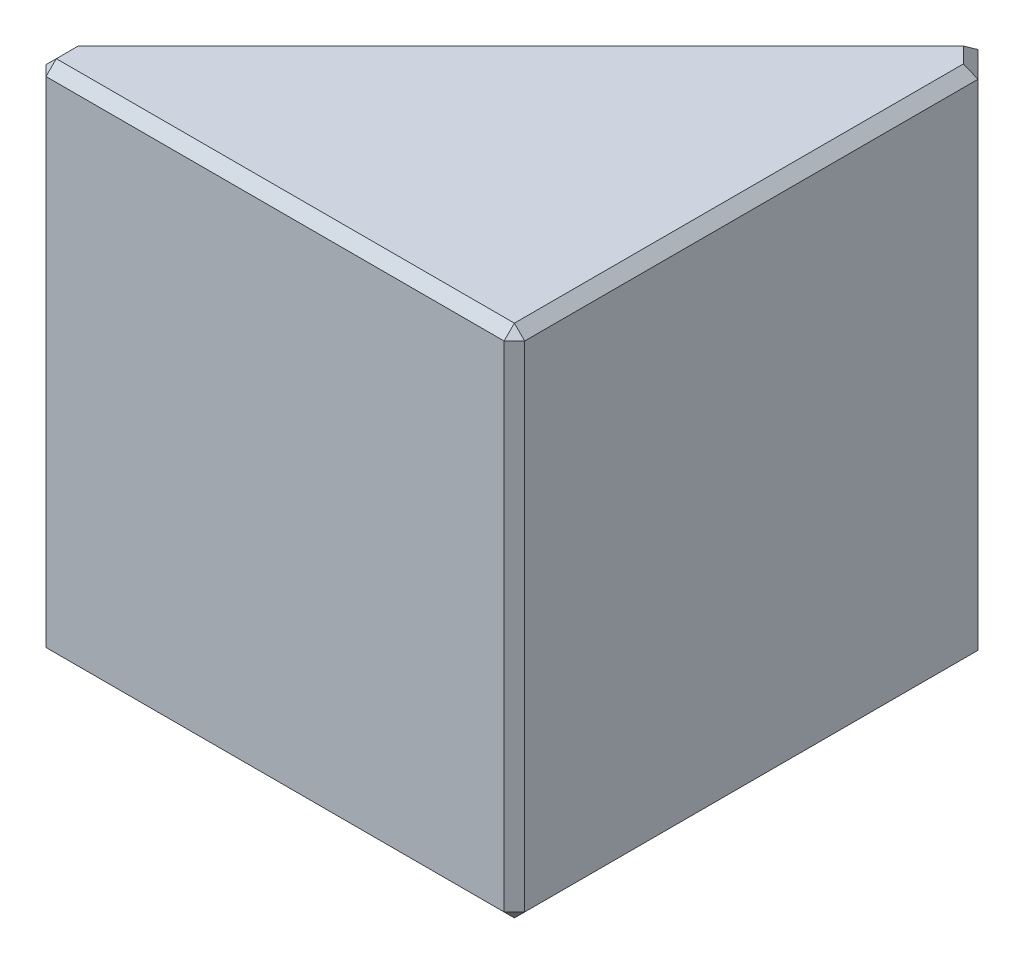
ISO-10303-21;
HEADER;
FILE_DESCRIPTION(('STEP AP214'),'2;1');
FILE_NAME('part.step','',(''),(''),'','','');
FILE_SCHEMA(('AUTOMOTIVE_DESIGN { 1 0 10303 214 1 1 1 1 }'));
ENDSEC;
DATA;
#1=APPLICATION_CONTEXT('core data for automotive mechanical design processes');
#2=APPLICATION_PROTOCOL_DEFINITION('international standard','automotive_design',2000,#1);
#3=PRODUCT_CONTEXT('',#1,'mechanical');
#4=PRODUCT('Part','Part','',(#3));
#5=PRODUCT_RELATED_PRODUCT_CATEGORY('part','',(#4));
#6=PRODUCT_DEFINITION_FORMATION('','',#4);
#7=PRODUCT_DEFINITION_CONTEXT('part definition',#1,'design');
#8=PRODUCT_DEFINITION('design','',#6,#7);
#9=PRODUCT_DEFINITION_SHAPE('','',#8);
#10=(LENGTH_UNIT() NAMED_UNIT(*) SI_UNIT(.MILLI.,.METRE.));
#11=(NAMED_UNIT(*) PLANE_ANGLE_UNIT() SI_UNIT($,.RADIAN.));
#12=(NAMED_UNIT(*) SI_UNIT($,.STERADIAN.) SOLID_ANGLE_UNIT());
#13=UNCERTAINTY_MEASURE_WITH_UNIT(LENGTH_MEASURE(1.E-05),#10,'distance_accuracy_value','');
#14=(GEOMETRIC_REPRESENTATION_CONTEXT(3) GLOBAL_UNCERTAINTY_ASSIGNED_CONTEXT((#13)) GLOBAL_UNIT_ASSIGNED_CONTEXT((#10,
#11,#12)) REPRESENTATION_CONTEXT('',''));
#15=CARTESIAN_POINT('',(0.,0.,0.));
#16=DIRECTION('',(0.,0.,1.));
#17=DIRECTION('',(1.,0.,0.));
#18=AXIS2_PLACEMENT_3D('',#15,#16,#17);
#19=CARTESIAN_POINT('',(0.,50.,0.));
#20=DIRECTION('',(0.,0.,-1.));
#21=DIRECTION('',(-1.,0.,0.));
#22=AXIS2_PLACEMENT_3D('',#19,#20,#21);
#23=PLANE('',#22);
#24=DIRECTION('',(1.,0.,0.));
#25=VECTOR('',#24,1.);
#26=CARTESIAN_POINT('',(0.,1.00000000000001,0.));
#27=LINE('',#26,#25);
#28=CARTESIAN_POINT('',(4.53553390593276,1.00000000000001,0.));
#29=VERTEX_POINT('',#28);
#30=CARTESIAN_POINT('',(49.,1.00000000000001,0.));
#31=VERTEX_POINT('',#30);
#32=EDGE_CURVE('E219',#29,#31,#27,.T.);
#33=ORIENTED_EDGE('',*,*,#32,.T.);
#34=DIRECTION('',(0.,1.,0.));
#35=VECTOR('',#34,1.);
#36=CARTESIAN_POINT('',(49.,50.,0.));
#37=LINE('',#36,#35);
#38=CARTESIAN_POINT('',(49.,49.,0.));
#39=VERTEX_POINT('',#38);
#40=EDGE_CURVE('E221',#31,#39,#37,.T.);
#41=ORIENTED_EDGE('',*,*,#40,.T.);
#42=DIRECTION('',(-1.,0.,0.));
#43=VECTOR('',#42,1.);
#44=CARTESIAN_POINT('',(3.53553390593274,49.,0.));
#45=LINE('',#44,#43);
#46=CARTESIAN_POINT('',(4.53553390593276,49.,0.));
#47=VERTEX_POINT('',#46);
#48=EDGE_CURVE('E143',#39,#47,#45,.T.);
#49=ORIENTED_EDGE('',*,*,#48,.T.);
#50=DIRECTION('',(0.,-1.,0.));
#51=VECTOR('',#50,1.);
#52=CARTESIAN_POINT('',(4.53553390593276,0.,0.));
#53=LINE('',#52,#51);
#54=EDGE_CURVE('E217',#47,#29,#53,.T.);
#55=ORIENTED_EDGE('',*,*,#54,.T.);
#56=EDGE_LOOP('',(#33,#41,#49,#55));
#57=FACE_BOUND('',#56,.T.);
#58=ADVANCED_FACE('F43',(#57),#23,.F.);
#59=CARTESIAN_POINT('',(50.,50.,0.));
#60=DIRECTION('',(-1.,0.,0.));
#61=DIRECTION('',(0.,0.,1.));
#62=AXIS2_PLACEMENT_3D('',#59,#60,#61);
#63=PLANE('',#62);
#64=DIRECTION('',(0.,-1.,0.));
#65=VECTOR('',#64,1.);
#66=CARTESIAN_POINT('',(50.,50.,-1.00000000000002));
#67=LINE('',#66,#65);
#68=CARTESIAN_POINT('',(50.,49.,-1.00000000000002));
#69=VERTEX_POINT('',#68);
#70=CARTESIAN_POINT('',(50.,1.00000000000002,-1.00000000000002));
#71=VERTEX_POINT('',#70);
#72=EDGE_CURVE('E139',#69,#71,#67,.T.);
#73=ORIENTED_EDGE('',*,*,#72,.T.);
#74=DIRECTION('',(0.,0.,-1.));
#75=VECTOR('',#74,1.);
#76=CARTESIAN_POINT('',(50.,1.00000000000002,0.));
#77=LINE('',#76,#75);
#78=CARTESIAN_POINT('',(50.,1.00000000000002,-45.));
#79=VERTEX_POINT('',#78);
#80=EDGE_CURVE('E133',#71,#79,#77,.T.);
#81=ORIENTED_EDGE('',*,*,#80,.T.);
#82=DIRECTION('',(0.,1.,0.));
#83=VECTOR('',#82,1.);
#84=CARTESIAN_POINT('',(50.,50.,-45.));
#85=LINE('',#84,#83);
#86=CARTESIAN_POINT('',(50.,49.,-45.));
#87=VERTEX_POINT('',#86);
#88=EDGE_CURVE('E136',#79,#87,#85,.T.);
#89=ORIENTED_EDGE('',*,*,#88,.T.);
#90=DIRECTION('',(0.,0.,1.));
#91=VECTOR('',#90,1.);
#92=CARTESIAN_POINT('',(50.,49.,0.));
#93=LINE('',#92,#91);
#94=EDGE_CURVE('E153',#87,#69,#93,.T.);
#95=ORIENTED_EDGE('',*,*,#94,.T.);
#96=EDGE_LOOP('',(#73,#81,#89,#95));
#97=FACE_BOUND('',#96,.T.);
#98=ADVANCED_FACE('F135',(#97),#63,.F.);
#99=CARTESIAN_POINT('',(0.,50.,0.));
#100=DIRECTION('',(0.707106781186547,0.,0.707106781186547));
#101=DIRECTION('',(0.707106781186548,0.,-0.707106781186548));
#102=AXIS2_PLACEMENT_3D('',#99,#100,#101);
#103=PLANE('',#102);
#104=DIRECTION('',(0.,-1.,0.));
#105=VECTOR('',#104,1.);
#106=CARTESIAN_POINT('',(47.5,50.,-47.5));
#107=LINE('',#106,#105);
#108=CARTESIAN_POINT('',(47.5,49.,-47.5));
#109=VERTEX_POINT('',#108);
#110=CARTESIAN_POINT('',(47.5,1.00000000000002,-47.5));
#111=VERTEX_POINT('',#110);
#112=EDGE_CURVE('E154',#109,#111,#107,.T.);
#113=ORIENTED_EDGE('',*,*,#112,.T.);
#114=DIRECTION('',(-0.707106781186548,0.,0.707106781186548));
#115=VECTOR('',#114,1.);
#116=CARTESIAN_POINT('',(0.,1.00000000000001,0.));
#117=LINE('',#116,#115);
#118=CARTESIAN_POINT('',(3.53553390593274,1.00000000000001,-3.53553390593274));
#119=VERTEX_POINT('',#118);
#120=EDGE_CURVE('E242',#111,#119,#117,.T.);
#121=ORIENTED_EDGE('',*,*,#120,.T.);
#122=DIRECTION('',(0.,1.,0.));
#123=VECTOR('',#122,1.);
#124=CARTESIAN_POINT('',(3.53553390593274,50.,-3.53553390593274));
#125=LINE('',#124,#123);
#126=CARTESIAN_POINT('',(3.53553390593274,49.,-3.53553390593274));
#127=VERTEX_POINT('',#126);
#128=EDGE_CURVE('E204',#119,#127,#125,.T.);
#129=ORIENTED_EDGE('',*,*,#128,.T.);
#130=DIRECTION('',(0.707106781186548,0.,-0.707106781186548));
#131=VECTOR('',#130,1.);
#132=CARTESIAN_POINT('',(47.5,49.,-47.5));
#133=LINE('',#132,#131);
#134=EDGE_CURVE('E240',#127,#109,#133,.T.);
#135=ORIENTED_EDGE('',*,*,#134,.T.);
#136=EDGE_LOOP('',(#113,#121,#129,#135));
#137=FACE_BOUND('',#136,.T.);
#138=ADVANCED_FACE('F304',(#137),#103,.F.);
#139=CARTESIAN_POINT('',(0.,50.,0.));
#140=DIRECTION('',(0.,1.,0.));
#141=DIRECTION('',(0.,0.,1.));
#142=AXIS2_PLACEMENT_3D('',#139,#140,#141);
#143=PLANE('',#142);
#144=DIRECTION('',(0.,0.,1.));
#145=VECTOR('',#144,1.);
#146=CARTESIAN_POINT('',(4.53553390593276,50.,0.));
#147=LINE('',#146,#145);
#148=CARTESIAN_POINT('',(4.53553390593275,50.,-3.12132034355964));
#149=VERTEX_POINT('',#148);
#150=CARTESIAN_POINT('',(4.53553390593276,50.,-1.00000000000001));
#151=VERTEX_POINT('',#150);
#152=EDGE_CURVE('E53',#149,#151,#147,.T.);
#153=ORIENTED_EDGE('',*,*,#152,.T.);
#154=DIRECTION('',(1.,0.,0.));
#155=VECTOR('',#154,1.);
#156=CARTESIAN_POINT('',(50.,50.,-1.00000000000001));
#157=LINE('',#156,#155);
#158=CARTESIAN_POINT('',(49.,50.,-1.00000000000001));
#159=VERTEX_POINT('',#158);
#160=EDGE_CURVE('E11',#151,#159,#157,.T.);
#161=ORIENTED_EDGE('',*,*,#160,.T.);
#162=DIRECTION('',(0.,0.,-1.));
#163=VECTOR('',#162,1.);
#164=CARTESIAN_POINT('',(49.,50.,-45.));
#165=LINE('',#164,#163);
#166=CARTESIAN_POINT('',(49.,50.,-44.5857864376269));
#167=VERTEX_POINT('',#166);
#168=EDGE_CURVE('E165',#159,#167,#165,.T.);
#169=ORIENTED_EDGE('',*,*,#168,.T.);
#170=DIRECTION('',(-0.707106781186551,0.,-0.707106781186544));
#171=VECTOR('',#170,1.);
#172=CARTESIAN_POINT('',(46.7928932188132,50.,-46.7928932188137));
#173=LINE('',#172,#171);
#174=CARTESIAN_POINT('',(47.5,50.,-46.0857864376269));
#175=VERTEX_POINT('',#174);
#176=EDGE_CURVE('E246',#167,#175,#173,.T.);
#177=ORIENTED_EDGE('',*,*,#176,.T.);
#178=DIRECTION('',(-0.707106781186548,0.,0.707106781186548));
#179=VECTOR('',#178,1.);
#180=CARTESIAN_POINT('',(4.2426406871193,50.,-2.82842712474618));
#181=LINE('',#180,#179);
#182=EDGE_CURVE('E64',#175,#149,#181,.T.);
#183=ORIENTED_EDGE('',*,*,#182,.T.);
#184=EDGE_LOOP('',(#153,#161,#169,#177,#183));
#185=FACE_BOUND('',#184,.T.);
#186=ADVANCED_FACE('F517',(#185),#143,.T.);
#187=CARTESIAN_POINT('',(0.,0.,0.));
#188=DIRECTION('',(0.,1.,0.));
#189=DIRECTION('',(0.,0.,1.));
#190=AXIS2_PLACEMENT_3D('',#187,#188,#189);
#191=PLANE('',#190);
#192=DIRECTION('',(-1.,0.,0.));
#193=VECTOR('',#192,1.);
#194=CARTESIAN_POINT('',(0.,0.,-1.00000000000002));
#195=LINE('',#194,#193);
#196=CARTESIAN_POINT('',(49.,0.,-1.00000000000002));
#197=VERTEX_POINT('',#196);
#198=CARTESIAN_POINT('',(4.53553390593276,0.,-1.00000000000002));
#199=VERTEX_POINT('',#198);
#200=EDGE_CURVE('E224',#197,#199,#195,.T.);
#201=ORIENTED_EDGE('',*,*,#200,.T.);
#202=DIRECTION('',(0.,0.,-1.));
#203=VECTOR('',#202,1.);
#204=CARTESIAN_POINT('',(4.53553390593275,0.,-3.53553390593274));
#205=LINE('',#204,#203);
#206=CARTESIAN_POINT('',(4.53553390593275,0.,-3.12132034355962));
#207=VERTEX_POINT('',#206);
#208=EDGE_CURVE('E231',#199,#207,#205,.T.);
#209=ORIENTED_EDGE('',*,*,#208,.T.);
#210=DIRECTION('',(0.707106781186548,0.,-0.707106781186548));
#211=VECTOR('',#210,1.);
#212=CARTESIAN_POINT('',(0.707106781186568,0.,0.707106781186568));
#213=LINE('',#212,#211);
#214=CARTESIAN_POINT('',(47.5,0.,-46.0857864376269));
#215=VERTEX_POINT('',#214);
#216=EDGE_CURVE('E229',#207,#215,#213,.T.);
#217=ORIENTED_EDGE('',*,*,#216,.T.);
#218=DIRECTION('',(0.707106781186551,0.,0.707106781186544));
#219=VECTOR('',#218,1.);
#220=CARTESIAN_POINT('',(49.2928932188134,0.,-44.2928932188134));
#221=LINE('',#220,#219);
#222=CARTESIAN_POINT('',(49.,0.,-44.5857864376269));
#223=VERTEX_POINT('',#222);
#224=EDGE_CURVE('E227',#215,#223,#221,.T.);
#225=ORIENTED_EDGE('',*,*,#224,.T.);
#226=DIRECTION('',(0.,0.,1.));
#227=VECTOR('',#226,1.);
#228=CARTESIAN_POINT('',(49.,0.,0.));
#229=LINE('',#228,#227);
#230=EDGE_CURVE('E168',#223,#197,#229,.T.);
#231=ORIENTED_EDGE('',*,*,#230,.T.);
#232=EDGE_LOOP('',(#201,#209,#217,#225,#231));
#233=FACE_BOUND('',#232,.T.);
#234=ADVANCED_FACE('F288',(#233),#191,.F.);
#235=CARTESIAN_POINT('',(47.5,50.,-47.5));
#236=DIRECTION('',(-0.707106781186544,0.,0.707106781186551));
#237=DIRECTION('',(0.,-1.,0.));
#238=AXIS2_PLACEMENT_3D('',#235,#236,#237);
#239=PLANE('',#238);
#240=ORIENTED_EDGE('',*,*,#88,.F.);
#241=DIRECTION('',(0.707106781186551,0.,0.707106781186544));
#242=VECTOR('',#241,1.);
#243=CARTESIAN_POINT('',(47.5,1.00000000000002,-47.5));
#244=LINE('',#243,#242);
#245=EDGE_CURVE('E149',#79,#111,#244,.F.);
#246=ORIENTED_EDGE('',*,*,#245,.T.);
#247=ORIENTED_EDGE('',*,*,#112,.F.);
#248=DIRECTION('',(-0.707106781186551,0.,-0.707106781186544));
#249=VECTOR('',#248,1.);
#250=CARTESIAN_POINT('',(47.5,49.,-47.5));
#251=LINE('',#250,#249);
#252=EDGE_CURVE('E152',#109,#87,#251,.F.);
#253=ORIENTED_EDGE('',*,*,#252,.T.);
#254=EDGE_LOOP('',(#240,#246,#247,#253));
#255=FACE_BOUND('',#254,.T.);
#256=ADVANCED_FACE('F147',(#255),#239,.F.);
#257=CARTESIAN_POINT('',(3.53553390593274,50.,0.));
#258=DIRECTION('',(1.,0.,0.));
#259=DIRECTION('',(0.,-1.,0.));
#260=AXIS2_PLACEMENT_3D('',#257,#258,#259);
#261=PLANE('',#260);
#262=ORIENTED_EDGE('',*,*,#128,.F.);
#263=DIRECTION('',(0.,0.,-1.));
#264=VECTOR('',#263,1.);
#265=CARTESIAN_POINT('',(3.53553390593274,1.00000000000002,0.));
#266=LINE('',#265,#264);
#267=CARTESIAN_POINT('',(3.53553390593274,1.00000000000002,-1.00000000000002));
#268=VERTEX_POINT('',#267);
#269=EDGE_CURVE('E238',#119,#268,#266,.F.);
#270=ORIENTED_EDGE('',*,*,#269,.T.);
#271=DIRECTION('',(0.,-1.,0.));
#272=VECTOR('',#271,1.);
#273=CARTESIAN_POINT('',(3.53553390593274,50.,-1.00000000000002));
#274=LINE('',#273,#272);
#275=CARTESIAN_POINT('',(3.53553390593274,49.,-1.00000000000002));
#276=VERTEX_POINT('',#275);
#277=EDGE_CURVE('E236',#268,#276,#274,.F.);
#278=ORIENTED_EDGE('',*,*,#277,.T.);
#279=DIRECTION('',(0.,0.,1.));
#280=VECTOR('',#279,1.);
#281=CARTESIAN_POINT('',(3.53553390593274,49.,0.));
#282=LINE('',#281,#280);
#283=EDGE_CURVE('E234',#276,#127,#282,.F.);
#284=ORIENTED_EDGE('',*,*,#283,.T.);
#285=EDGE_LOOP('',(#262,#270,#278,#284));
#286=FACE_BOUND('',#285,.T.);
#287=ADVANCED_FACE('F300',(#286),#261,.F.);
#288=CARTESIAN_POINT('',(4.53553390593276,50.,0.));
#289=DIRECTION('',(-0.70710678118655,0.707106781186545,0.));
#290=DIRECTION('',(0.,0.,-1.));
#291=AXIS2_PLACEMENT_3D('',#288,#289,#290);
#292=PLANE('',#291);
#293=DIRECTION('',(-0.707106781186545,-0.70710678118655,0.));
#294=VECTOR('',#293,1.);
#295=CARTESIAN_POINT('',(3.53553390593274,49.,-1.00000000000002));
#296=LINE('',#295,#294);
#297=EDGE_CURVE('E192',#151,#276,#296,.T.);
#298=ORIENTED_EDGE('',*,*,#297,.F.);
#299=ORIENTED_EDGE('',*,*,#152,.F.);
#300=DIRECTION('',(0.678598344545845,0.67859834454585,0.281084637714819));
#301=VECTOR('',#300,1.);
#302=CARTESIAN_POINT('',(3.50280748322076,48.967273577288,-3.549089634068));
#303=LINE('',#302,#301);
#304=EDGE_CURVE('E48',#127,#149,#303,.T.);
#305=ORIENTED_EDGE('',*,*,#304,.F.);
#306=ORIENTED_EDGE('',*,*,#283,.F.);
#307=EDGE_LOOP('',(#298,#299,#305,#306));
#308=FACE_BOUND('',#307,.T.);
#309=ADVANCED_FACE('F46',(#308),#292,.T.);
#310=CARTESIAN_POINT('',(0.707106781186558,50.,0.707106781186558));
#311=DIRECTION('',(-0.500000000000002,0.707106781186545,-0.500000000000002));
#312=DIRECTION('',(0.707106781186548,0.,-0.707106781186548));
#313=AXIS2_PLACEMENT_3D('',#310,#311,#312);
#314=PLANE('',#313);
#315=ORIENTED_EDGE('',*,*,#304,.T.);
#316=ORIENTED_EDGE('',*,*,#182,.F.);
#317=DIRECTION('',(0.,0.577350269189628,0.816496580927724));
#318=VECTOR('',#317,1.);
#319=CARTESIAN_POINT('',(47.5,49.6666666666665,-46.5571909584181));
#320=LINE('',#319,#318);
#321=EDGE_CURVE('E189',#109,#175,#320,.T.);
#322=ORIENTED_EDGE('',*,*,#321,.F.);
#323=ORIENTED_EDGE('',*,*,#134,.F.);
#324=EDGE_LOOP('',(#315,#316,#322,#323));
#325=FACE_BOUND('',#324,.T.);
#326=ADVANCED_FACE('F303',(#325),#314,.T.);
#327=CARTESIAN_POINT('',(0.,1.00000000000001,0.));
#328=DIRECTION('',(0.499999999999998,0.70710678118655,0.499999999999998));
#329=DIRECTION('',(-0.707106781186548,0.,0.707106781186548));
#330=AXIS2_PLACEMENT_3D('',#327,#328,#329);
#331=PLANE('',#330);
#332=DIRECTION('',(0.,0.577350269189626,-0.816496580927726));
#333=VECTOR('',#332,1.);
#334=CARTESIAN_POINT('',(47.5,0.333333333333463,-46.5571909584181));
#335=LINE('',#334,#333);
#336=EDGE_CURVE('E164',#215,#111,#335,.T.);
#337=ORIENTED_EDGE('',*,*,#336,.F.);
#338=ORIENTED_EDGE('',*,*,#216,.F.);
#339=DIRECTION('',(-0.678598344545842,0.678598344545847,-0.281084637714832));
#340=VECTOR('',#339,1.);
#341=CARTESIAN_POINT('',(2.58181605678006,1.95371784915271,-3.93057677372911));
#342=LINE('',#341,#340);
#343=EDGE_CURVE('E197',#119,#207,#342,.F.);
#344=ORIENTED_EDGE('',*,*,#343,.F.);
#345=ORIENTED_EDGE('',*,*,#120,.F.);
#346=EDGE_LOOP('',(#337,#338,#344,#345));
#347=FACE_BOUND('',#346,.T.);
#348=ADVANCED_FACE('F307',(#347),#331,.F.);
#349=CARTESIAN_POINT('',(4.53553390593276,0.,0.));
#350=DIRECTION('',(0.70710678118655,0.707106781186545,0.));
#351=DIRECTION('',(0.,0.,-1.));
#352=AXIS2_PLACEMENT_3D('',#349,#350,#351);
#353=PLANE('',#352);
#354=ORIENTED_EDGE('',*,*,#343,.T.);
#355=ORIENTED_EDGE('',*,*,#208,.F.);
#356=DIRECTION('',(-0.707106781186545,0.70710678118655,0.));
#357=VECTOR('',#356,1.);
#358=CARTESIAN_POINT('',(3.53553390593274,1.00000000000002,-1.00000000000002));
#359=LINE('',#358,#357);
#360=EDGE_CURVE('E185',#268,#199,#359,.F.);
#361=ORIENTED_EDGE('',*,*,#360,.F.);
#362=ORIENTED_EDGE('',*,*,#269,.F.);
#363=EDGE_LOOP('',(#354,#355,#361,#362));
#364=FACE_BOUND('',#363,.T.);
#365=ADVANCED_FACE('F290',(#364),#353,.F.);
#366=CARTESIAN_POINT('',(4.53553390593276,50.,0.));
#367=DIRECTION('',(0.70710678118655,0.,-0.707106781186545));
#368=DIRECTION('',(0.,-1.,0.));
#369=AXIS2_PLACEMENT_3D('',#366,#367,#368);
#370=PLANE('',#369);
#371=DIRECTION('',(-0.707106781186545,0.,-0.70710678118655));
#372=VECTOR('',#371,1.);
#373=CARTESIAN_POINT('',(3.53553390593274,49.,-1.00000000000002));
#374=LINE('',#373,#372);
#375=EDGE_CURVE('E195',#276,#47,#374,.F.);
#376=ORIENTED_EDGE('',*,*,#375,.F.);
#377=ORIENTED_EDGE('',*,*,#277,.F.);
#378=DIRECTION('',(0.707106781186545,0.,0.70710678118655));
#379=VECTOR('',#378,1.);
#380=CARTESIAN_POINT('',(3.53553390593274,1.00000000000002,-1.00000000000002));
#381=LINE('',#380,#379);
#382=EDGE_CURVE('E182',#29,#268,#381,.F.);
#383=ORIENTED_EDGE('',*,*,#382,.F.);
#384=ORIENTED_EDGE('',*,*,#54,.F.);
#385=EDGE_LOOP('',(#376,#377,#383,#384));
#386=FACE_BOUND('',#385,.T.);
#387=ADVANCED_FACE('F297',(#386),#370,.F.);
#388=CARTESIAN_POINT('',(3.53553390593274,49.,-1.00000000000002));
#389=DIRECTION('',(-0.57735026918963,0.577350269189622,0.577350269189626));
#390=DIRECTION('',(0.707106781186545,0.,0.70710678118655));
#391=AXIS2_PLACEMENT_3D('',#388,#389,#390);
#392=PLANE('',#391);
#393=ORIENTED_EDGE('',*,*,#297,.T.);
#394=ORIENTED_EDGE('',*,*,#375,.T.);
#395=DIRECTION('',(0.,0.70710678118655,-0.707106781186545));
#396=VECTOR('',#395,1.);
#397=CARTESIAN_POINT('',(4.53553390593276,49.5,-0.500000000000007));
#398=LINE('',#397,#396);
#399=EDGE_CURVE('E173',#151,#47,#398,.F.);
#400=ORIENTED_EDGE('',*,*,#399,.F.);
#401=EDGE_LOOP('',(#393,#394,#400));
#402=FACE_BOUND('',#401,.T.);
#403=ADVANCED_FACE('F388',(#402),#392,.T.);
#404=CARTESIAN_POINT('',(46.7928932188132,50.,-46.7928932188137));
#405=DIRECTION('',(0.499999999999997,0.707106781186547,-0.500000000000003));
#406=DIRECTION('',(0.707106781186551,0.,0.707106781186544));
#407=AXIS2_PLACEMENT_3D('',#404,#405,#406);
#408=PLANE('',#407);
#409=ORIENTED_EDGE('',*,*,#321,.T.);
#410=ORIENTED_EDGE('',*,*,#176,.F.);
#411=DIRECTION('',(-0.678598344545843,0.678598344545848,0.281084637714827));
#412=VECTOR('',#411,1.);
#413=CARTESIAN_POINT('',(40.4955479311845,58.5044520688155,-41.0631270501715));
#414=LINE('',#413,#412);
#415=EDGE_CURVE('E169',#87,#167,#414,.T.);
#416=ORIENTED_EDGE('',*,*,#415,.F.);
#417=ORIENTED_EDGE('',*,*,#252,.F.);
#418=EDGE_LOOP('',(#409,#410,#416,#417));
#419=FACE_BOUND('',#418,.T.);
#420=ADVANCED_FACE('F382',(#419),#408,.T.);
#421=CARTESIAN_POINT('',(46.7928932188132,0.,-46.7928932188137));
#422=DIRECTION('',(-0.499999999999997,0.707106781186547,0.500000000000003));
#423=DIRECTION('',(0.707106781186551,0.,0.707106781186544));
#424=AXIS2_PLACEMENT_3D('',#421,#422,#423);
#425=PLANE('',#424);
#426=ORIENTED_EDGE('',*,*,#336,.T.);
#427=ORIENTED_EDGE('',*,*,#245,.F.);
#428=DIRECTION('',(0.678598344545843,0.678598344545848,-0.281084637714827));
#429=VECTOR('',#428,1.);
#430=CARTESIAN_POINT('',(41.4165393576253,-7.58346064237477,-41.4446141898326));
#431=LINE('',#430,#429);
#432=EDGE_CURVE('E161',#223,#79,#431,.T.);
#433=ORIENTED_EDGE('',*,*,#432,.F.);
#434=ORIENTED_EDGE('',*,*,#224,.F.);
#435=EDGE_LOOP('',(#426,#427,#433,#434));
#436=FACE_BOUND('',#435,.T.);
#437=ADVANCED_FACE('F159',(#436),#425,.F.);
#438=CARTESIAN_POINT('',(3.53553390593274,1.00000000000002,-1.00000000000002));
#439=DIRECTION('',(-0.577350269189629,-0.577350269189626,0.577350269189622));
#440=DIRECTION('',(0.707106781186545,-0.70710678118655,0.));
#441=AXIS2_PLACEMENT_3D('',#438,#439,#440);
#442=PLANE('',#441);
#443=ORIENTED_EDGE('',*,*,#382,.T.);
#444=ORIENTED_EDGE('',*,*,#360,.T.);
#445=DIRECTION('',(0.,-0.707106781186545,-0.70710678118655));
#446=VECTOR('',#445,1.);
#447=CARTESIAN_POINT('',(4.53553390593276,0.500000000000008,-0.50000000000001));
#448=LINE('',#447,#446);
#449=EDGE_CURVE('E170',#29,#199,#448,.T.);
#450=ORIENTED_EDGE('',*,*,#449,.F.);
#451=EDGE_LOOP('',(#443,#444,#450));
#452=FACE_BOUND('',#451,.T.);
#453=ADVANCED_FACE('F292',(#452),#442,.T.);
#454=CARTESIAN_POINT('',(0.,50.,-1.00000000000001));
#455=DIRECTION('',(0.,0.707106781186545,0.70710678118655));
#456=DIRECTION('',(-1.,0.,0.));
#457=AXIS2_PLACEMENT_3D('',#454,#455,#456);
#458=PLANE('',#457);
#459=ORIENTED_EDGE('',*,*,#399,.T.);
#460=ORIENTED_EDGE('',*,*,#48,.F.);
#461=DIRECTION('',(0.,-0.70710678118655,0.707106781186545));
#462=VECTOR('',#461,1.);
#463=CARTESIAN_POINT('',(49.,49.,0.));
#464=LINE('',#463,#462);
#465=EDGE_CURVE('E176',#159,#39,#464,.T.);
#466=ORIENTED_EDGE('',*,*,#465,.F.);
#467=ORIENTED_EDGE('',*,*,#160,.F.);
#468=EDGE_LOOP('',(#459,#460,#466,#467));
#469=FACE_BOUND('',#468,.T.);
#470=ADVANCED_FACE('F271',(#469),#458,.T.);
#471=CARTESIAN_POINT('',(49.,50.,0.));
#472=DIRECTION('',(0.70710678118655,0.707106781186545,0.));
#473=DIRECTION('',(0.,0.,1.));
#474=AXIS2_PLACEMENT_3D('',#471,#472,#473);
#475=PLANE('',#474);
#476=ORIENTED_EDGE('',*,*,#415,.T.);
#477=ORIENTED_EDGE('',*,*,#168,.F.);
#478=DIRECTION('',(-0.707106781186545,0.70710678118655,0.));
#479=VECTOR('',#478,1.);
#480=CARTESIAN_POINT('',(49.5,49.5,-1.00000000000002));
#481=LINE('',#480,#479);
#482=EDGE_CURVE('E260',#69,#159,#481,.T.);
#483=ORIENTED_EDGE('',*,*,#482,.F.);
#484=ORIENTED_EDGE('',*,*,#94,.F.);
#485=EDGE_LOOP('',(#476,#477,#483,#484));
#486=FACE_BOUND('',#485,.T.);
#487=ADVANCED_FACE('F360',(#486),#475,.T.);
#488=CARTESIAN_POINT('',(50.,1.00000000000002,0.));
#489=DIRECTION('',(-0.70710678118655,0.707106781186545,0.));
#490=DIRECTION('',(0.,0.,-1.));
#491=AXIS2_PLACEMENT_3D('',#488,#489,#490);
#492=PLANE('',#491);
#493=ORIENTED_EDGE('',*,*,#432,.T.);
#494=ORIENTED_EDGE('',*,*,#80,.F.);
#495=DIRECTION('',(-0.707106781186545,-0.70710678118655,0.));
#496=VECTOR('',#495,1.);
#497=CARTESIAN_POINT('',(50.,1.00000000000002,-1.00000000000002));
#498=LINE('',#497,#496);
#499=EDGE_CURVE('E257',#197,#71,#498,.F.);
#500=ORIENTED_EDGE('',*,*,#499,.F.);
#501=ORIENTED_EDGE('',*,*,#230,.F.);
#502=EDGE_LOOP('',(#493,#494,#500,#501));
#503=FACE_BOUND('',#502,.T.);
#504=ADVANCED_FACE('F167',(#503),#492,.F.);
#505=CARTESIAN_POINT('',(0.,1.00000000000001,0.));
#506=DIRECTION('',(0.,0.70710678118655,-0.707106781186545));
#507=DIRECTION('',(1.,0.,0.));
#508=AXIS2_PLACEMENT_3D('',#505,#506,#507);
#509=PLANE('',#508);
#510=ORIENTED_EDGE('',*,*,#449,.T.);
#511=ORIENTED_EDGE('',*,*,#200,.F.);
#512=DIRECTION('',(0.,0.707106781186545,0.70710678118655));
#513=VECTOR('',#512,1.);
#514=CARTESIAN_POINT('',(49.,0.500000000000007,-0.500000000000011));
#515=LINE('',#514,#513);
#516=EDGE_CURVE('E254',#31,#197,#515,.F.);
#517=ORIENTED_EDGE('',*,*,#516,.F.);
#518=ORIENTED_EDGE('',*,*,#32,.F.);
#519=EDGE_LOOP('',(#510,#511,#517,#518));
#520=FACE_BOUND('',#519,.T.);
#521=ADVANCED_FACE('F285',(#520),#509,.F.);
#522=CARTESIAN_POINT('',(49.,49.,0.));
#523=DIRECTION('',(0.57735026918963,0.577350269189622,0.577350269189626));
#524=DIRECTION('',(0.707106781186545,0.,-0.70710678118655));
#525=AXIS2_PLACEMENT_3D('',#522,#523,#524);
#526=PLANE('',#525);
#527=ORIENTED_EDGE('',*,*,#482,.T.);
#528=ORIENTED_EDGE('',*,*,#465,.T.);
#529=DIRECTION('',(-0.707106781186545,0.,0.70710678118655));
#530=VECTOR('',#529,1.);
#531=CARTESIAN_POINT('',(49.,49.,0.));
#532=LINE('',#531,#530);
#533=EDGE_CURVE('E252',#69,#39,#532,.T.);
#534=ORIENTED_EDGE('',*,*,#533,.F.);
#535=EDGE_LOOP('',(#527,#528,#534));
#536=FACE_BOUND('',#535,.T.);
#537=ADVANCED_FACE('F266',(#536),#526,.T.);
#538=CARTESIAN_POINT('',(50.,1.00000000000002,-1.00000000000002));
#539=DIRECTION('',(0.57735026918963,-0.577350269189626,0.577350269189622));
#540=DIRECTION('',(0.707106781186545,0.70710678118655,0.));
#541=AXIS2_PLACEMENT_3D('',#538,#539,#540);
#542=PLANE('',#541);
#543=ORIENTED_EDGE('',*,*,#516,.T.);
#544=ORIENTED_EDGE('',*,*,#499,.T.);
#545=DIRECTION('',(0.707106781186545,0.,-0.70710678118655));
#546=VECTOR('',#545,1.);
#547=CARTESIAN_POINT('',(50.,1.00000000000002,-1.00000000000002));
#548=LINE('',#547,#546);
#549=EDGE_CURVE('E250',#31,#71,#548,.T.);
#550=ORIENTED_EDGE('',*,*,#549,.F.);
#551=EDGE_LOOP('',(#543,#544,#550));
#552=FACE_BOUND('',#551,.T.);
#553=ADVANCED_FACE('F282',(#552),#542,.T.);
#554=CARTESIAN_POINT('',(50.,50.,-1.00000000000002));
#555=DIRECTION('',(-0.70710678118655,0.,-0.707106781186545));
#556=DIRECTION('',(0.,-1.,0.));
#557=AXIS2_PLACEMENT_3D('',#554,#555,#556);
#558=PLANE('',#557);
#559=ORIENTED_EDGE('',*,*,#533,.T.);
#560=ORIENTED_EDGE('',*,*,#40,.F.);
#561=ORIENTED_EDGE('',*,*,#549,.T.);
#562=ORIENTED_EDGE('',*,*,#72,.F.);
#563=EDGE_LOOP('',(#559,#560,#561,#562));
#564=FACE_BOUND('',#563,.T.);
#565=ADVANCED_FACE('F280',(#564),#558,.F.);
#566=CLOSED_SHELL('',(#58,#98,#138,#186,#234,#256,#287,#309,#326,#348,#365,#387,#403,#420,#437,
#453,#470,#487,#504,#521,#537,#553,#565));
#567=MANIFOLD_SOLID_BREP('B2',#566);
#568=ADVANCED_BREP_SHAPE_REPRESENTATION('',(#18,#567),#14);
#569=SHAPE_DEFINITION_REPRESENTATION(#9,#568);
ENDSEC;
END-ISO-10303-21;
